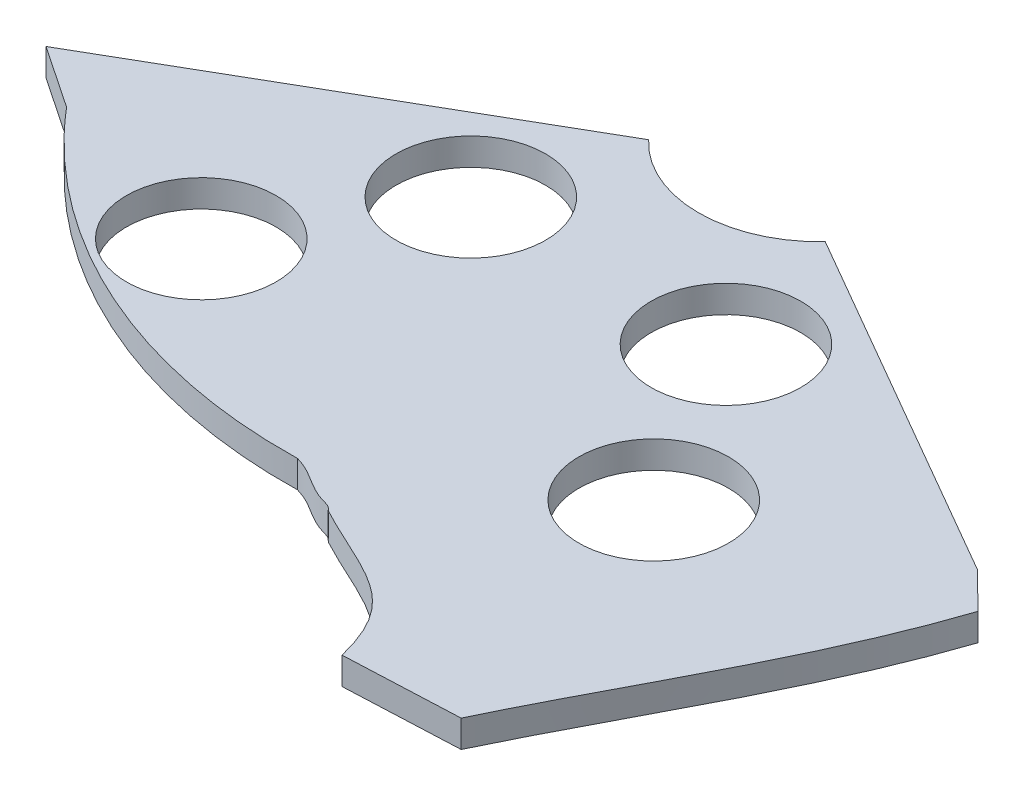
ISO-10303-21;
HEADER;
FILE_DESCRIPTION(('STEP AP214'),'2;1');
FILE_NAME('part.step','',(''),(''),'','','');
FILE_SCHEMA(('AUTOMOTIVE_DESIGN { 1 0 10303 214 1 1 1 1 }'));
ENDSEC;
DATA;
#1=APPLICATION_CONTEXT('core data for automotive mechanical design processes');
#2=APPLICATION_PROTOCOL_DEFINITION('international standard','automotive_design',2000,#1);
#3=PRODUCT_CONTEXT('',#1,'mechanical');
#4=PRODUCT('Part','Part','',(#3));
#5=PRODUCT_RELATED_PRODUCT_CATEGORY('part','',(#4));
#6=PRODUCT_DEFINITION_FORMATION('','',#4);
#7=PRODUCT_DEFINITION_CONTEXT('part definition',#1,'design');
#8=PRODUCT_DEFINITION('design','',#6,#7);
#9=PRODUCT_DEFINITION_SHAPE('','',#8);
#10=(LENGTH_UNIT() NAMED_UNIT(*) SI_UNIT(.MILLI.,.METRE.));
#11=(NAMED_UNIT(*) PLANE_ANGLE_UNIT() SI_UNIT($,.RADIAN.));
#12=(NAMED_UNIT(*) SI_UNIT($,.STERADIAN.) SOLID_ANGLE_UNIT());
#13=UNCERTAINTY_MEASURE_WITH_UNIT(LENGTH_MEASURE(1.E-05),#10,'distance_accuracy_value','');
#14=(GEOMETRIC_REPRESENTATION_CONTEXT(3) GLOBAL_UNCERTAINTY_ASSIGNED_CONTEXT((#13)) GLOBAL_UNIT_ASSIGNED_CONTEXT((#10,
#11,#12)) REPRESENTATION_CONTEXT('',''));
#15=CARTESIAN_POINT('',(0.,0.,0.));
#16=DIRECTION('',(0.,0.,1.));
#17=DIRECTION('',(1.,0.,0.));
#18=AXIS2_PLACEMENT_3D('',#15,#16,#17);
#19=CARTESIAN_POINT('',(0.,-55.7359999999999,0.));
#20=DIRECTION('',(0.,-1.,0.));
#21=DIRECTION('',(0.,0.,-1.));
#22=AXIS2_PLACEMENT_3D('',#19,#20,#21);
#23=PLANE('',#22);
#24=CARTESIAN_POINT('',(18.75,-55.7359999999999,32.476));
#25=DIRECTION('',(0.,-1.,0.));
#26=DIRECTION('',(0.,0.,-1.));
#27=AXIS2_PLACEMENT_3D('',#24,#25,#26);
#28=CIRCLE('',#27,10.999845998306);
#29=CARTESIAN_POINT('',(18.75,-55.7359999999999,21.476154001694));
#30=VERTEX_POINT('',#29);
#31=EDGE_CURVE('E330',#30,#30,#28,.T.);
#32=ORIENTED_EDGE('',*,*,#31,.F.);
#33=EDGE_LOOP('',(#32));
#34=FACE_BOUND('',#33,.T.);
#35=CARTESIAN_POINT('',(-33.25,-55.7359999999999,57.591));
#36=DIRECTION('',(0.,-1.,0.));
#37=DIRECTION('',(0.,0.,-1.));
#38=AXIS2_PLACEMENT_3D('',#35,#36,#37);
#39=CIRCLE('',#38,10.999845998306);
#40=CARTESIAN_POINT('',(-33.25,-55.7359999999999,46.591154001694));
#41=VERTEX_POINT('',#40);
#42=EDGE_CURVE('E323',#41,#41,#39,.T.);
#43=ORIENTED_EDGE('',*,*,#42,.F.);
#44=EDGE_LOOP('',(#43));
#45=FACE_BOUND('',#44,.T.);
#46=DIRECTION('',(-0.829811438442502,0.,-0.55804388414352));
#47=VECTOR('',#46,1.);
#48=CARTESIAN_POINT('',(-59.9026889800837,-55.7359999999999,50.7341335970389));
#49=LINE('',#48,#47);
#50=CARTESIAN_POINT('',(-59.9026889800837,-55.7359999999999,50.7341335970389));
#51=VERTEX_POINT('',#50);
#52=CARTESIAN_POINT('',(-69.1281865828208,-55.7359999999999,44.5300343560704));
#53=VERTEX_POINT('',#52);
#54=EDGE_CURVE('E319',#51,#53,#49,.T.);
#55=ORIENTED_EDGE('',*,*,#54,.T.);
#56=DIRECTION('',(0.866025113443951,0.,-0.500000502884138));
#57=VECTOR('',#56,1.);
#58=CARTESIAN_POINT('',(-69.1281865828208,-55.7359999999999,44.5300343560704));
#59=LINE('',#58,#57);
#60=CARTESIAN_POINT('',(-12.9766531358799,-55.7359999999999,12.1108879302399));
#61=VERTEX_POINT('',#60);
#62=EDGE_CURVE('E101',#53,#61,#59,.T.);
#63=ORIENTED_EDGE('',*,*,#62,.T.);
#64=CARTESIAN_POINT('',(0.,-55.7359999999999,0.));
#65=DIRECTION('',(0.,1.,0.));
#66=DIRECTION('',(0.,0.,-1.));
#67=AXIS2_PLACEMENT_3D('',#64,#65,#66);
#68=CIRCLE('',#67,17.7501305084715);
#69=CARTESIAN_POINT('',(12.9766531358511,-55.7359999999999,12.1108879302707));
#70=VERTEX_POINT('',#69);
#71=EDGE_CURVE('E316',#61,#70,#68,.T.);
#72=ORIENTED_EDGE('',*,*,#71,.T.);
#73=DIRECTION('',(0.866025113442762,0.,0.500000502886198));
#74=VECTOR('',#73,1.);
#75=CARTESIAN_POINT('',(12.9766531358511,-55.7359999999999,12.1108879302707));
#76=LINE('',#75,#74);
#77=CARTESIAN_POINT('',(65.8946490574716,-55.7359999999999,42.6631480920527));
#78=VERTEX_POINT('',#77);
#79=EDGE_CURVE('E311',#70,#78,#76,.T.);
#80=ORIENTED_EDGE('',*,*,#79,.T.);
#81=DIRECTION('',(0.71276060883614,0.,0.701407381263937));
#82=VECTOR('',#81,1.);
#83=CARTESIAN_POINT('',(65.8946490574716,-55.7359999999999,42.6631480920527));
#84=LINE('',#83,#82);
#85=CARTESIAN_POINT('',(71.2569655837216,-55.7359999999999,47.9400508074354));
#86=VERTEX_POINT('',#85);
#87=EDGE_CURVE('E292',#78,#86,#84,.T.);
#88=ORIENTED_EDGE('',*,*,#87,.T.);
#89=CARTESIAN_POINT('',(46.8641701729329,-55.7359999999999,99.5037287815529));
#90=CARTESIAN_POINT('',(47.0265115042572,-55.7359999999999,99.1639758438634));
#91=CARTESIAN_POINT('',(47.3534052611885,-55.7359999999999,98.4798425222766));
#92=CARTESIAN_POINT('',(48.1029507468316,-55.7359999999999,96.9321409517117));
#93=CARTESIAN_POINT('',(49.5477537564018,-55.7359999999999,94.0033280060252));
#94=CARTESIAN_POINT('',(51.732027717249,-55.7359999999999,89.7213104111649));
#95=CARTESIAN_POINT('',(54.4073463883031,-55.7359999999999,84.6111656064253));
#96=CARTESIAN_POINT('',(57.0950462566859,-55.7359999999999,79.5075655121861));
#97=CARTESIAN_POINT('',(59.7539425678854,-55.7359999999999,74.3895727380711));
#98=CARTESIAN_POINT('',(63.205579053323,-55.7359999999999,67.5258789821495));
#99=CARTESIAN_POINT('',(66.444433973775,-55.7359999999999,60.5582516015325));
#100=CARTESIAN_POINT('',(69.3268198353086,-55.7359999999999,53.4391651245445));
#101=CARTESIAN_POINT('',(70.6350197868272,-55.7359999999999,49.8037730442733));
#102=CARTESIAN_POINT('',(71.2501842992512,-55.7359999999999,47.9603715986118));
#103=CARTESIAN_POINT('',(71.2569655837216,-55.7359999999999,47.9400508074354));
#104=B_SPLINE_CURVE_WITH_KNOTS('',3,(#89,#90,#91,#92,#93,#94,#95,#96,#97,#98,#99,#100,#101,#102,
#103),.UNSPECIFIED.,.F.,.F.,(4,1,1,1,1,1,1,1,1,1,1,1,4),(0.,0.0197841570331341,
0.0398377749370308,0.090352224975045,0.191370070537669,0.292390723298131,0.393413635393049,
0.494432323574486,0.595411840898034,0.797075984450142,0.897894653524489,0.998874438647857,1.),.UNSPECIFIED.);
#105=CARTESIAN_POINT('',(46.8641701729329,-55.7359999999999,99.5037287815529));
#106=VERTEX_POINT('',#105);
#107=EDGE_CURVE('E244',#86,#106,#104,.F.);
#108=ORIENTED_EDGE('',*,*,#107,.T.);
#109=DIRECTION('',(-0.99902030206008,0.,0.0442542209488083));
#110=VECTOR('',#109,1.);
#111=CARTESIAN_POINT('',(46.8641701729329,-55.7359999999999,99.5037287815529));
#112=LINE('',#111,#110);
#113=CARTESIAN_POINT('',(30.0912883166282,-55.7359999999999,100.246727515499));
#114=VERTEX_POINT('',#113);
#115=EDGE_CURVE('E128',#106,#114,#112,.T.);
#116=ORIENTED_EDGE('',*,*,#115,.T.);
#117=CARTESIAN_POINT('',(10.7021695545972,-55.7359999999999,82.8693068197618));
#118=CARTESIAN_POINT('',(10.9675136919166,-55.7359999999999,83.0133841412206));
#119=CARTESIAN_POINT('',(11.6145615888685,-55.7359999999999,83.3574112982969));
#120=CARTESIAN_POINT('',(12.6933991443115,-55.7359999999999,83.9045634279865));
#121=CARTESIAN_POINT('',(13.7694716585437,-55.7359999999999,84.4264424495065));
#122=CARTESIAN_POINT('',(15.1536940168009,-55.7359999999999,85.0794640703698));
#123=CARTESIAN_POINT('',(16.8049849745752,-55.7359999999999,85.842126936412));
#124=CARTESIAN_POINT('',(18.8821519742874,-55.7359999999999,86.815188160623));
#125=CARTESIAN_POINT('',(20.9239285814879,-55.7359999999999,87.8518072734378));
#126=CARTESIAN_POINT('',(22.8957800805199,-55.7359999999999,89.0177780126231));
#127=CARTESIAN_POINT('',(24.7379643670664,-55.7359999999999,90.388313116472));
#128=CARTESIAN_POINT('',(26.0889968196911,-55.7359999999999,91.7442165107431));
#129=CARTESIAN_POINT('',(27.0241346187956,-55.7359999999999,92.9479614874679));
#130=CARTESIAN_POINT('',(27.6482925382816,-55.7359999999999,93.8961812701836));
#131=CARTESIAN_POINT('',(28.2076529250503,-55.7359999999999,94.9000883087401));
#132=CARTESIAN_POINT('',(28.6098476237093,-55.7359999999999,95.7509898906972));
#133=CARTESIAN_POINT('',(28.8976421765824,-55.7359999999999,96.4353672784788));
#134=CARTESIAN_POINT('',(29.092105617481,-55.7359999999999,96.932761864078));
#135=CARTESIAN_POINT('',(29.2785297597457,-55.7359999999999,97.4458234702081));
#136=CARTESIAN_POINT('',(29.4570267990977,-55.7359999999999,97.9747138386339));
#137=CARTESIAN_POINT('',(29.6277727458872,-55.7359999999999,98.519551210424));
#138=CARTESIAN_POINT('',(29.7906463028335,-55.7359999999999,99.0805104353948));
#139=CARTESIAN_POINT('',(29.9466361992917,-55.7359999999999,99.657463530404));
#140=CARTESIAN_POINT('',(30.0427046456018,-55.7359999999999,100.048814010141));
#141=CARTESIAN_POINT('',(30.0912883166282,-55.7359999999999,100.246727515499));
#142=B_SPLINE_CURVE_WITH_KNOTS('',3,(#117,#118,#119,#120,#121,#122,#123,#124,#125,#126,#127,
#128,#129,#130,#131,#132,#133,#134,#135,#136,#137,#138,#139,#140,#141),.UNSPECIFIED.,.F.,.F.,(4,
1,1,1,1,1,1,1,1,1,1,1,1,1,1,1,1,1,1,1,1,1,4),(0.,0.0311053789907297,0.0754938822372659,
0.124612365066205,0.15430953554767,0.233171101897679,0.31200037754726,0.390613081095202,
0.46899979538581,0.547734881795915,0.626539846701343,0.665271985243445,0.704629857498265,
0.743369873375361,0.783575693819359,0.801518810116923,0.819850640318988,0.838589345978821,
0.857751633808876,0.877352807158534,0.897406821958587,0.917926226477165,0.93892049238304),.UNSPECIFIED.);
#143=CARTESIAN_POINT('',(10.702169554607,-55.7359999999999,82.8693068197671));
#144=VERTEX_POINT('',#143);
#145=EDGE_CURVE('E120',#114,#144,#142,.F.);
#146=ORIENTED_EDGE('',*,*,#145,.T.);
#147=CARTESIAN_POINT('',(1.78759080649489,-55.7359999999999,78.4791809716169));
#148=CARTESIAN_POINT('',(1.86611483391024,-55.7359999999999,78.50208582267));
#149=CARTESIAN_POINT('',(2.01454982366164,-55.7359999999999,78.545383160354));
#150=CARTESIAN_POINT('',(2.32717764748113,-55.7359999999999,78.6447134972182));
#151=CARTESIAN_POINT('',(2.88503031573728,-55.7359999999999,78.8416157048517));
#152=CARTESIAN_POINT('',(3.67875011300494,-55.7359999999999,79.1865082825985));
#153=CARTESIAN_POINT('',(4.5916431569298,-55.7359999999999,79.6815420613968));
#154=CARTESIAN_POINT('',(5.32869270280636,-55.7359999999999,80.1364074170496));
#155=CARTESIAN_POINT('',(5.91786643705039,-55.7359999999999,80.5030573597553));
#156=CARTESIAN_POINT('',(6.51021516800735,-55.7359999999999,80.8622799860879));
#157=CARTESIAN_POINT('',(7.26626333955956,-55.7359999999999,81.2827982001088));
#158=CARTESIAN_POINT('',(8.05817996956523,-55.7359999999999,81.6336987758542));
#159=CARTESIAN_POINT('',(8.61707654654181,-55.7359999999999,81.8294901349075));
#160=CARTESIAN_POINT('',(9.48118675970946,-55.7359999999999,82.0963864525241));
#161=CARTESIAN_POINT('',(10.2068056960977,-55.7359999999999,82.218104211485));
#162=CARTESIAN_POINT('',(10.7021695546157,-55.7359999999999,82.8693068197606));
#163=B_SPLINE_CURVE_WITH_KNOTS('',3,(#147,#148,#149,#150,#151,#152,#153,#154,#155,#156,#157,
#158,#159,#160,#161,#162),.UNSPECIFIED.,.F.,.F.,(4,1,1,1,1,1,1,1,1,1,1,1,1,4),
(-0.432204638892321,-0.402257498925563,-0.375595170932457,-0.312112875645156,-0.185727956735441,
-0.0592405553676042,0.0677662645816927,0.131338895871027,0.194834804074498,0.321408196780351,
0.447827551805123,0.511369746514113,0.538135298637163,0.778915690365187),.UNSPECIFIED.);
#164=CARTESIAN_POINT('',(1.78759080649489,-55.7359999999999,78.4791809716169));
#165=VERTEX_POINT('',#164);
#166=EDGE_CURVE('E125',#144,#165,#163,.F.);
#167=ORIENTED_EDGE('',*,*,#166,.T.);
#168=CARTESIAN_POINT('',(-59.9026889800837,-55.7359999999999,50.7341335970389));
#169=CARTESIAN_POINT('',(-56.1364810023361,-55.7359999999999,55.1801667903006));
#170=CARTESIAN_POINT('',(-51.8729053251242,-55.7359999999999,59.2071280243108));
#171=CARTESIAN_POINT('',(-44.8893655819632,-55.7359999999999,64.4645799991853));
#172=CARTESIAN_POINT('',(-42.4634872738905,-55.7359999999999,66.0877313134504));
#173=CARTESIAN_POINT('',(-37.4473849856873,-55.7359999999999,69.0542236916702));
#174=CARTESIAN_POINT('',(-34.8574828460895,-55.7359999999999,70.3967494896049));
#175=CARTESIAN_POINT('',(-29.5414719880855,-55.7359999999999,72.7872093066937));
#176=CARTESIAN_POINT('',(-26.8178007031177,-55.7359999999999,73.8350289916238));
#177=CARTESIAN_POINT('',(-21.2710748649198,-55.7359999999999,75.6194401283735));
#178=CARTESIAN_POINT('',(-18.4471151931364,-55.7359999999999,76.3570128349456));
#179=CARTESIAN_POINT('',(-9.87915904933974,-55.7359999999999,78.0932034608287));
#180=CARTESIAN_POINT('',(-4.03874659644219,-55.7359999999999,78.6113119438143));
#181=CARTESIAN_POINT('',(1.78759080659621,-55.7359999999999,78.4791809760741));
#182=B_SPLINE_CURVE_WITH_KNOTS('',3,(#168,#169,#170,#171,#172,#173,#174,#175,#176,#177,#178,
#179,#180,#181),.UNSPECIFIED.,.F.,.F.,(4,2,2,2,2,2,4),(1.58787845205843E-06,0.250001587878453,
0.375001587878453,0.500001587878453,0.625001587878453,0.750001587878452,1.),.UNSPECIFIED.);
#183=EDGE_CURVE('E49',#165,#51,#182,.F.);
#184=ORIENTED_EDGE('',*,*,#183,.T.);
#185=EDGE_LOOP('',(#55,#63,#72,#80,#88,#108,#116,#146,#167,#184));
#186=FACE_BOUND('',#185,.T.);
#187=CARTESIAN_POINT('',(33.25,-55.7359999999999,57.591));
#188=DIRECTION('',(0.,-1.,0.));
#189=DIRECTION('',(0.,0.,-1.));
#190=AXIS2_PLACEMENT_3D('',#187,#188,#189);
#191=CIRCLE('',#190,10.999845998306);
#192=CARTESIAN_POINT('',(33.25,-55.7359999999999,46.591154001694));
#193=VERTEX_POINT('',#192);
#194=EDGE_CURVE('E324',#193,#193,#191,.T.);
#195=ORIENTED_EDGE('',*,*,#194,.F.);
#196=EDGE_LOOP('',(#195));
#197=FACE_BOUND('',#196,.T.);
#198=CARTESIAN_POINT('',(-18.75,-55.7359999999999,32.476));
#199=DIRECTION('',(0.,-1.,0.));
#200=DIRECTION('',(0.,0.,-1.));
#201=AXIS2_PLACEMENT_3D('',#198,#199,#200);
#202=CIRCLE('',#201,10.999845998306);
#203=CARTESIAN_POINT('',(-18.75,-55.7359999999999,21.476154001694));
#204=VERTEX_POINT('',#203);
#205=EDGE_CURVE('E336',#204,#204,#202,.T.);
#206=ORIENTED_EDGE('',*,*,#205,.F.);
#207=EDGE_LOOP('',(#206));
#208=FACE_BOUND('',#207,.T.);
#209=ADVANCED_FACE('F30',(#34,#45,#186,#197,#208),#23,.T.);
#210=CARTESIAN_POINT('',(0.,-51.7359999999999,0.));
#211=DIRECTION('',(0.,-1.,0.));
#212=DIRECTION('',(0.,0.,-1.));
#213=AXIS2_PLACEMENT_3D('',#210,#211,#212);
#214=PLANE('',#213);
#215=CARTESIAN_POINT('',(18.75,-51.7359999999999,32.476));
#216=DIRECTION('',(0.,-1.,0.));
#217=DIRECTION('',(0.,0.,-1.));
#218=AXIS2_PLACEMENT_3D('',#215,#216,#217);
#219=CIRCLE('',#218,10.999845998306);
#220=CARTESIAN_POINT('',(18.75,-51.7359999999999,21.476154001694));
#221=VERTEX_POINT('',#220);
#222=EDGE_CURVE('E333',#221,#221,#219,.T.);
#223=ORIENTED_EDGE('',*,*,#222,.T.);
#224=EDGE_LOOP('',(#223));
#225=FACE_BOUND('',#224,.T.);
#226=CARTESIAN_POINT('',(-33.25,-51.7359999999999,57.591));
#227=DIRECTION('',(0.,-1.,0.));
#228=DIRECTION('',(0.,0.,-1.));
#229=AXIS2_PLACEMENT_3D('',#226,#227,#228);
#230=CIRCLE('',#229,10.999845998306);
#231=CARTESIAN_POINT('',(-33.25,-51.7359999999999,46.591154001694));
#232=VERTEX_POINT('',#231);
#233=EDGE_CURVE('E320',#232,#232,#230,.T.);
#234=ORIENTED_EDGE('',*,*,#233,.T.);
#235=EDGE_LOOP('',(#234));
#236=FACE_BOUND('',#235,.T.);
#237=DIRECTION('',(-0.829811438442502,0.,-0.55804388414352));
#238=VECTOR('',#237,1.);
#239=CARTESIAN_POINT('',(-59.9026889800837,-51.7359999999999,50.7341335970389));
#240=LINE('',#239,#238);
#241=CARTESIAN_POINT('',(-59.9026889800837,-51.7359999999999,50.7341335970389));
#242=VERTEX_POINT('',#241);
#243=CARTESIAN_POINT('',(-69.1281865828208,-51.7359999999999,44.5300343560704));
#244=VERTEX_POINT('',#243);
#245=EDGE_CURVE('E192',#242,#244,#240,.T.);
#246=ORIENTED_EDGE('',*,*,#245,.F.);
#247=CARTESIAN_POINT('',(1.78770182548704,-51.7359999999999,78.4791784582845));
#248=CARTESIAN_POINT('',(-4.0386724050451,-51.7359999999999,78.6113185253767));
#249=CARTESIAN_POINT('',(-9.87912276952495,-51.7359999999999,78.0932108124856));
#250=CARTESIAN_POINT('',(-18.4471151931364,-51.7359999999999,76.3570128349456));
#251=CARTESIAN_POINT('',(-21.2710748649198,-51.7359999999999,75.6194401283735));
#252=CARTESIAN_POINT('',(-26.8178007031177,-51.7359999999999,73.8350289916238));
#253=CARTESIAN_POINT('',(-29.5414719880855,-51.7359999999999,72.7872093066937));
#254=CARTESIAN_POINT('',(-34.8574828460895,-51.7359999999999,70.3967494896049));
#255=CARTESIAN_POINT('',(-37.4473849856873,-51.7359999999999,69.0542236916702));
#256=CARTESIAN_POINT('',(-42.4634872738905,-51.7359999999999,66.0877313134504));
#257=CARTESIAN_POINT('',(-44.8893655819632,-51.7359999999999,64.4645799991853));
#258=CARTESIAN_POINT('',(-51.8729053251242,-51.7359999999999,59.2071280243108));
#259=CARTESIAN_POINT('',(-56.1364810023361,-51.7359999999999,55.1801667903006));
#260=CARTESIAN_POINT('',(-59.9026889800837,-51.7359999999999,50.7341335970389));
#261=B_SPLINE_CURVE_WITH_KNOTS('',3,(#247,#248,#249,#250,#251,#252,#253,#254,#255,#256,#257,
#258,#259,#260),.UNSPECIFIED.,.F.,.F.,(4,2,2,2,2,2,4),(0.,0.25,0.375,0.5,0.625,0.75,1.),.UNSPECIFIED.);
#262=CARTESIAN_POINT('',(1.78759080649489,-51.7359999999999,78.4791809716169));
#263=VERTEX_POINT('',#262);
#264=EDGE_CURVE('E92',#263,#242,#261,.T.);
#265=ORIENTED_EDGE('',*,*,#264,.F.);
#266=CARTESIAN_POINT('',(10.7021695546157,-51.7359999999999,82.8693068197606));
#267=CARTESIAN_POINT('',(10.2068056960977,-51.7359999999999,82.218104211485));
#268=CARTESIAN_POINT('',(9.48118675970946,-51.7359999999999,82.0963864525241));
#269=CARTESIAN_POINT('',(8.61707654654181,-51.7359999999999,81.8294901349075));
#270=CARTESIAN_POINT('',(8.05817996956523,-51.7359999999999,81.6336987758542));
#271=CARTESIAN_POINT('',(7.26626333955956,-51.7359999999999,81.2827982001088));
#272=CARTESIAN_POINT('',(6.51021516800735,-51.7359999999999,80.8622799860879));
#273=CARTESIAN_POINT('',(5.91786643705039,-51.7359999999999,80.5030573597553));
#274=CARTESIAN_POINT('',(5.32869270280636,-51.7359999999999,80.1364074170496));
#275=CARTESIAN_POINT('',(4.5916431569298,-51.7359999999999,79.6815420613968));
#276=CARTESIAN_POINT('',(3.67875011300494,-51.7359999999999,79.1865082825985));
#277=CARTESIAN_POINT('',(2.88503031573728,-51.7359999999999,78.8416157048517));
#278=CARTESIAN_POINT('',(2.32717764748113,-51.7359999999999,78.6447134972182));
#279=CARTESIAN_POINT('',(2.01454982366164,-51.7359999999999,78.545383160354));
#280=CARTESIAN_POINT('',(1.86611483391024,-51.7359999999999,78.50208582267));
#281=CARTESIAN_POINT('',(1.78759080649489,-51.7359999999999,78.4791809716169));
#282=B_SPLINE_CURVE_WITH_KNOTS('',3,(#266,#267,#268,#269,#270,#271,#272,#273,#274,#275,#276,
#277,#278,#279,#280,#281),.UNSPECIFIED.,.F.,.F.,(4,1,1,1,1,1,1,1,1,1,1,1,1,4),
(-0.432204638892321,-0.191424247164296,-0.164658695041246,-0.101116500332256,0.0253028546925155,
0.151876247398369,0.215372155601839,0.278944786891174,0.405951606840471,0.532439008208308,
0.658823927118023,0.722306222405324,0.748968550398429,0.778915690365187),.UNSPECIFIED.);
#283=CARTESIAN_POINT('',(10.702169554607,-51.7359999999999,82.8693068197671));
#284=VERTEX_POINT('',#283);
#285=EDGE_CURVE('E85',#284,#263,#282,.T.);
#286=ORIENTED_EDGE('',*,*,#285,.F.);
#287=CARTESIAN_POINT('',(30.0912883166282,-51.7359999999999,100.246727515499));
#288=CARTESIAN_POINT('',(30.0427046456018,-51.7359999999999,100.048814010141));
#289=CARTESIAN_POINT('',(29.9466361992917,-51.7359999999999,99.657463530404));
#290=CARTESIAN_POINT('',(29.7906463028335,-51.7359999999999,99.0805104353948));
#291=CARTESIAN_POINT('',(29.6277727458872,-51.7359999999999,98.519551210424));
#292=CARTESIAN_POINT('',(29.4570267990977,-51.7359999999999,97.9747138386339));
#293=CARTESIAN_POINT('',(29.2785297597457,-51.7359999999999,97.4458234702081));
#294=CARTESIAN_POINT('',(29.092105617481,-51.7359999999999,96.932761864078));
#295=CARTESIAN_POINT('',(28.8976421765824,-51.7359999999999,96.4353672784788));
#296=CARTESIAN_POINT('',(28.6098476237093,-51.7359999999999,95.7509898906972));
#297=CARTESIAN_POINT('',(28.2076529250503,-51.7359999999999,94.9000883087401));
#298=CARTESIAN_POINT('',(27.6482925382816,-51.7359999999999,93.8961812701836));
#299=CARTESIAN_POINT('',(27.0241346187956,-51.7359999999999,92.9479614874679));
#300=CARTESIAN_POINT('',(26.0889968196911,-51.7359999999999,91.7442165107431));
#301=CARTESIAN_POINT('',(24.7379643670664,-51.7359999999999,90.388313116472));
#302=CARTESIAN_POINT('',(22.8957800805199,-51.7359999999999,89.0177780126231));
#303=CARTESIAN_POINT('',(20.9239285814879,-51.7359999999999,87.8518072734378));
#304=CARTESIAN_POINT('',(18.8821519742874,-51.7359999999999,86.815188160623));
#305=CARTESIAN_POINT('',(16.8049849745752,-51.7359999999999,85.842126936412));
#306=CARTESIAN_POINT('',(15.1536940168009,-51.7359999999999,85.0794640703698));
#307=CARTESIAN_POINT('',(13.7694716585437,-51.7359999999999,84.4264424495065));
#308=CARTESIAN_POINT('',(12.6933991443115,-51.7359999999999,83.9045634279865));
#309=CARTESIAN_POINT('',(11.6145615888685,-51.7359999999999,83.3574112982969));
#310=CARTESIAN_POINT('',(10.9675136919166,-51.7359999999999,83.0133841412206));
#311=CARTESIAN_POINT('',(10.7021695545972,-51.7359999999999,82.8693068197618));
#312=B_SPLINE_CURVE_WITH_KNOTS('',3,(#287,#288,#289,#290,#291,#292,#293,#294,#295,#296,#297,
#298,#299,#300,#301,#302,#303,#304,#305,#306,#307,#308,#309,#310,#311),.UNSPECIFIED.,.F.,.F.,(4,
1,1,1,1,1,1,1,1,1,1,1,1,1,1,1,1,1,1,1,1,1,4),(0.,0.0209942659058756,0.0415136704244533,
0.0615676852245057,0.0811688585741645,0.100331146404219,0.119069852064053,0.137401682266118,
0.155344798563681,0.19555061900768,0.234290634884776,0.273648507139595,0.312380645681697,
0.391185610587126,0.46992069699723,0.548307411287838,0.626920114835781,0.705749390485361,
0.78461095683537,0.814308127316835,0.863426610145774,0.90781511339231,0.93892049238304),.UNSPECIFIED.);
#313=CARTESIAN_POINT('',(30.0912883166282,-51.7359999999999,100.246727515499));
#314=VERTEX_POINT('',#313);
#315=EDGE_CURVE('E138',#314,#284,#312,.T.);
#316=ORIENTED_EDGE('',*,*,#315,.F.);
#317=DIRECTION('',(-0.99902030206008,0.,0.0442542209488083));
#318=VECTOR('',#317,1.);
#319=CARTESIAN_POINT('',(46.8641701729329,-51.7359999999999,99.5037287815529));
#320=LINE('',#319,#318);
#321=CARTESIAN_POINT('',(46.8641701729329,-51.7359999999999,99.5037287815529));
#322=VERTEX_POINT('',#321);
#323=EDGE_CURVE('E265',#322,#314,#320,.T.);
#324=ORIENTED_EDGE('',*,*,#323,.F.);
#325=CARTESIAN_POINT('',(71.2569655837216,-51.7359999999999,47.9400508074354));
#326=CARTESIAN_POINT('',(71.2501842992512,-51.7359999999999,47.9603715986118));
#327=CARTESIAN_POINT('',(70.6350197868272,-51.7359999999999,49.8037730442733));
#328=CARTESIAN_POINT('',(69.3268198353086,-51.7359999999999,53.4391651245445));
#329=CARTESIAN_POINT('',(66.444433973775,-51.7359999999999,60.5582516015325));
#330=CARTESIAN_POINT('',(63.205579053323,-51.7359999999999,67.5258789821495));
#331=CARTESIAN_POINT('',(59.7539425678854,-51.7359999999999,74.3895727380711));
#332=CARTESIAN_POINT('',(57.0950462566859,-51.7359999999999,79.5075655121861));
#333=CARTESIAN_POINT('',(54.4073463883031,-51.7359999999999,84.6111656064253));
#334=CARTESIAN_POINT('',(51.732027717249,-51.7359999999999,89.7213104111649));
#335=CARTESIAN_POINT('',(49.5477537564018,-51.7359999999999,94.0033280060252));
#336=CARTESIAN_POINT('',(48.1029507468316,-51.7359999999999,96.9321409517117));
#337=CARTESIAN_POINT('',(47.3534052611885,-51.7359999999999,98.4798425222766));
#338=CARTESIAN_POINT('',(47.0265115042572,-51.7359999999999,99.1639758438634));
#339=CARTESIAN_POINT('',(46.8641701729329,-51.7359999999999,99.5037287815529));
#340=B_SPLINE_CURVE_WITH_KNOTS('',3,(#325,#326,#327,#328,#329,#330,#331,#332,#333,#334,#335,
#336,#337,#338,#339),.UNSPECIFIED.,.F.,.F.,(4,1,1,1,1,1,1,1,1,1,1,1,4),(0.,0.00112556135214314,
0.102105346475511,0.202924015549858,0.404588159101966,0.505567676425514,0.606586364606951,
0.707609276701869,0.808629929462331,0.909647775024955,0.960162225062969,0.980215842966866,1.),.UNSPECIFIED.);
#341=CARTESIAN_POINT('',(71.2569655837216,-51.7359999999999,47.9400508074354));
#342=VERTEX_POINT('',#341);
#343=EDGE_CURVE('E272',#342,#322,#340,.T.);
#344=ORIENTED_EDGE('',*,*,#343,.F.);
#345=DIRECTION('',(0.71276060883614,0.,0.701407381263937));
#346=VECTOR('',#345,1.);
#347=CARTESIAN_POINT('',(65.8946490574716,-51.7359999999999,42.6631480920527));
#348=LINE('',#347,#346);
#349=CARTESIAN_POINT('',(65.8946490574716,-51.7359999999999,42.6631480920527));
#350=VERTEX_POINT('',#349);
#351=EDGE_CURVE('E196',#350,#342,#348,.T.);
#352=ORIENTED_EDGE('',*,*,#351,.F.);
#353=DIRECTION('',(0.866025113442762,0.,0.500000502886198));
#354=VECTOR('',#353,1.);
#355=CARTESIAN_POINT('',(12.9766531358511,-51.7359999999999,12.1108879302707));
#356=LINE('',#355,#354);
#357=CARTESIAN_POINT('',(12.9766531358511,-51.7359999999999,12.1108879302707));
#358=VERTEX_POINT('',#357);
#359=EDGE_CURVE('E194',#358,#350,#356,.T.);
#360=ORIENTED_EDGE('',*,*,#359,.F.);
#361=CARTESIAN_POINT('',(0.,-51.7359999999999,0.));
#362=DIRECTION('',(0.,1.,0.));
#363=DIRECTION('',(0.,0.,-1.));
#364=AXIS2_PLACEMENT_3D('',#361,#362,#363);
#365=CIRCLE('',#364,17.7501305084715);
#366=CARTESIAN_POINT('',(-12.9766531358799,-51.7359999999999,12.1108879302399));
#367=VERTEX_POINT('',#366);
#368=EDGE_CURVE('E191',#367,#358,#365,.T.);
#369=ORIENTED_EDGE('',*,*,#368,.F.);
#370=DIRECTION('',(0.866025113443951,0.,-0.500000502884138));
#371=VECTOR('',#370,1.);
#372=CARTESIAN_POINT('',(-69.1281865828208,-51.7359999999999,44.5300343560704));
#373=LINE('',#372,#371);
#374=EDGE_CURVE('E186',#244,#367,#373,.T.);
#375=ORIENTED_EDGE('',*,*,#374,.F.);
#376=EDGE_LOOP('',(#246,#265,#286,#316,#324,#344,#352,#360,#369,#375));
#377=FACE_BOUND('',#376,.T.);
#378=CARTESIAN_POINT('',(33.25,-51.7359999999999,57.591));
#379=DIRECTION('',(0.,-1.,0.));
#380=DIRECTION('',(0.,0.,-1.));
#381=AXIS2_PLACEMENT_3D('',#378,#379,#380);
#382=CIRCLE('',#381,10.999845998306);
#383=CARTESIAN_POINT('',(33.25,-51.7359999999999,46.591154001694));
#384=VERTEX_POINT('',#383);
#385=EDGE_CURVE('E327',#384,#384,#382,.T.);
#386=ORIENTED_EDGE('',*,*,#385,.T.);
#387=EDGE_LOOP('',(#386));
#388=FACE_BOUND('',#387,.T.);
#389=CARTESIAN_POINT('',(-18.75,-51.7359999999999,32.476));
#390=DIRECTION('',(0.,-1.,0.));
#391=DIRECTION('',(0.,0.,-1.));
#392=AXIS2_PLACEMENT_3D('',#389,#390,#391);
#393=CIRCLE('',#392,10.999845998306);
#394=CARTESIAN_POINT('',(-18.75,-51.7359999999999,21.476154001694));
#395=VERTEX_POINT('',#394);
#396=EDGE_CURVE('E339',#395,#395,#393,.T.);
#397=ORIENTED_EDGE('',*,*,#396,.T.);
#398=EDGE_LOOP('',(#397));
#399=FACE_BOUND('',#398,.T.);
#400=ADVANCED_FACE('F218',(#225,#236,#377,#388,#399),#214,.F.);
#401=CARTESIAN_POINT('',(-59.9026889800837,-55.7359999999999,50.7341335970389));
#402=DIRECTION('',(0.55804388414352,0.,-0.829811438442502));
#403=DIRECTION('',(-0.829811438442502,0.,-0.55804388414352));
#404=AXIS2_PLACEMENT_3D('',#401,#402,#403);
#405=PLANE('',#404);
#406=ORIENTED_EDGE('',*,*,#245,.T.);
#407=DIRECTION('',(0.,1.,0.));
#408=VECTOR('',#407,1.);
#409=CARTESIAN_POINT('',(-69.1281865828208,-55.7359999999999,44.5300343560704));
#410=LINE('',#409,#408);
#411=EDGE_CURVE('E11',#53,#244,#410,.T.);
#412=ORIENTED_EDGE('',*,*,#411,.F.);
#413=ORIENTED_EDGE('',*,*,#54,.F.);
#414=DIRECTION('',(0.,1.,0.));
#415=VECTOR('',#414,1.);
#416=CARTESIAN_POINT('',(-59.9026889800837,-55.7359999999999,50.7341335970389));
#417=LINE('',#416,#415);
#418=EDGE_CURVE('E501',#51,#242,#417,.T.);
#419=ORIENTED_EDGE('',*,*,#418,.T.);
#420=EDGE_LOOP('',(#406,#412,#413,#419));
#421=FACE_BOUND('',#420,.T.);
#422=ADVANCED_FACE('F32',(#421),#405,.F.);
#423=CARTESIAN_POINT('',(-69.1281865828208,-55.7359999999999,44.5300343560704));
#424=DIRECTION('',(0.500000502884138,0.,0.866025113443951));
#425=DIRECTION('',(0.866025113443951,0.,-0.500000502884138));
#426=AXIS2_PLACEMENT_3D('',#423,#424,#425);
#427=PLANE('',#426);
#428=ORIENTED_EDGE('',*,*,#374,.T.);
#429=DIRECTION('',(0.,1.,0.));
#430=VECTOR('',#429,1.);
#431=CARTESIAN_POINT('',(-12.9766531358799,-55.7359999999999,12.1108879302399));
#432=LINE('',#431,#430);
#433=EDGE_CURVE('E40',#61,#367,#432,.T.);
#434=ORIENTED_EDGE('',*,*,#433,.F.);
#435=ORIENTED_EDGE('',*,*,#62,.F.);
#436=ORIENTED_EDGE('',*,*,#411,.T.);
#437=EDGE_LOOP('',(#428,#434,#435,#436));
#438=FACE_BOUND('',#437,.T.);
#439=ADVANCED_FACE('F358',(#438),#427,.F.);
#440=CARTESIAN_POINT('',(0.,-55.7359999999999,0.));
#441=DIRECTION('',(0.,1.,0.));
#442=DIRECTION('',(0.,0.,1.));
#443=AXIS2_PLACEMENT_3D('',#440,#441,#442);
#444=CYLINDRICAL_SURFACE('',#443,17.7501305084715);
#445=ORIENTED_EDGE('',*,*,#368,.T.);
#446=DIRECTION('',(0.,1.,0.));
#447=VECTOR('',#446,1.);
#448=CARTESIAN_POINT('',(12.9766531358511,-55.7359999999999,12.1108879302707));
#449=LINE('',#448,#447);
#450=EDGE_CURVE('E200',#70,#358,#449,.T.);
#451=ORIENTED_EDGE('',*,*,#450,.F.);
#452=ORIENTED_EDGE('',*,*,#71,.F.);
#453=ORIENTED_EDGE('',*,*,#433,.T.);
#454=EDGE_LOOP('',(#445,#451,#452,#453));
#455=FACE_BOUND('',#454,.T.);
#456=ADVANCED_FACE('F425',(#455),#444,.F.);
#457=CARTESIAN_POINT('',(12.9766531358511,-55.7359999999999,12.1108879302707));
#458=DIRECTION('',(-0.500000502886198,0.,0.866025113442762));
#459=DIRECTION('',(0.866025113442762,0.,0.500000502886198));
#460=AXIS2_PLACEMENT_3D('',#457,#458,#459);
#461=PLANE('',#460);
#462=ORIENTED_EDGE('',*,*,#359,.T.);
#463=DIRECTION('',(0.,1.,0.));
#464=VECTOR('',#463,1.);
#465=CARTESIAN_POINT('',(65.8946490574716,-55.7359999999999,42.6631480920527));
#466=LINE('',#465,#464);
#467=EDGE_CURVE('E197',#78,#350,#466,.T.);
#468=ORIENTED_EDGE('',*,*,#467,.F.);
#469=ORIENTED_EDGE('',*,*,#79,.F.);
#470=ORIENTED_EDGE('',*,*,#450,.T.);
#471=EDGE_LOOP('',(#462,#468,#469,#470));
#472=FACE_BOUND('',#471,.T.);
#473=ADVANCED_FACE('F417',(#472),#461,.F.);
#474=CARTESIAN_POINT('',(65.8946490574716,-55.7359999999999,42.6631480920527));
#475=DIRECTION('',(-0.701407381263937,0.,0.71276060883614));
#476=DIRECTION('',(0.71276060883614,0.,0.701407381263937));
#477=AXIS2_PLACEMENT_3D('',#474,#475,#476);
#478=PLANE('',#477);
#479=ORIENTED_EDGE('',*,*,#351,.T.);
#480=DIRECTION('',(0.,1.,0.));
#481=VECTOR('',#480,1.);
#482=CARTESIAN_POINT('',(71.2569655837216,-55.7359999999999,47.9400508074354));
#483=LINE('',#482,#481);
#484=EDGE_CURVE('E201',#86,#342,#483,.T.);
#485=ORIENTED_EDGE('',*,*,#484,.F.);
#486=ORIENTED_EDGE('',*,*,#87,.F.);
#487=ORIENTED_EDGE('',*,*,#467,.T.);
#488=EDGE_LOOP('',(#479,#485,#486,#487));
#489=FACE_BOUND('',#488,.T.);
#490=ADVANCED_FACE('F304',(#489),#478,.F.);
#491=CARTESIAN_POINT('',(71.2569655837216,-55.7359999999999,47.9400508074354));
#492=CARTESIAN_POINT('',(71.2501842992512,-55.7359999999999,47.9603715986118));
#493=CARTESIAN_POINT('',(70.6350197868272,-55.7359999999999,49.8037730442733));
#494=CARTESIAN_POINT('',(69.3268198353086,-55.7359999999999,53.4391651245445));
#495=CARTESIAN_POINT('',(66.444433973775,-55.7359999999999,60.5582516015325));
#496=CARTESIAN_POINT('',(63.205579053323,-55.7359999999999,67.5258789821495));
#497=CARTESIAN_POINT('',(59.7539425678854,-55.7359999999999,74.3895727380711));
#498=CARTESIAN_POINT('',(57.0950462566859,-55.7359999999999,79.5075655121861));
#499=CARTESIAN_POINT('',(54.4073463883031,-55.7359999999999,84.6111656064253));
#500=CARTESIAN_POINT('',(51.732027717249,-55.7359999999999,89.7213104111649));
#501=CARTESIAN_POINT('',(49.5477537564018,-55.7359999999999,94.0033280060252));
#502=CARTESIAN_POINT('',(48.1029507468316,-55.7359999999999,96.9321409517117));
#503=CARTESIAN_POINT('',(47.3534052611885,-55.7359999999999,98.4798425222766));
#504=CARTESIAN_POINT('',(47.0265115042572,-55.7359999999999,99.1639758438634));
#505=CARTESIAN_POINT('',(46.8641701729329,-55.7359999999999,99.5037287815529));
#506=B_SPLINE_CURVE_WITH_KNOTS('',3,(#491,#492,#493,#494,#495,#496,#497,#498,#499,#500,#501,
#502,#503,#504,#505),.UNSPECIFIED.,.F.,.F.,(4,1,1,1,1,1,1,1,1,1,1,1,4),(0.,0.00112556135214314,
0.102105346475511,0.202924015549858,0.404588159101966,0.505567676425514,0.606586364606951,
0.707609276701869,0.808629929462331,0.909647775024955,0.960162225062969,0.980215842966866,1.),.UNSPECIFIED.);
#507=DIRECTION('',(0.,1.,0.));
#508=VECTOR('',#507,1.);
#509=SURFACE_OF_LINEAR_EXTRUSION('',#506,#508);
#510=ORIENTED_EDGE('',*,*,#343,.T.);
#511=DIRECTION('',(0.,1.,0.));
#512=VECTOR('',#511,1.);
#513=CARTESIAN_POINT('',(46.8641701729329,-55.7359999999999,99.5037287815529));
#514=LINE('',#513,#512);
#515=EDGE_CURVE('E248',#106,#322,#514,.T.);
#516=ORIENTED_EDGE('',*,*,#515,.F.);
#517=ORIENTED_EDGE('',*,*,#107,.F.);
#518=ORIENTED_EDGE('',*,*,#484,.T.);
#519=EDGE_LOOP('',(#510,#516,#517,#518));
#520=FACE_BOUND('',#519,.T.);
#521=ADVANCED_FACE('F294',(#520),#509,.F.);
#522=CARTESIAN_POINT('',(46.8641701729329,-55.7359999999999,99.5037287815529));
#523=DIRECTION('',(-0.0442542209488083,0.,-0.99902030206008));
#524=DIRECTION('',(-0.99902030206008,0.,0.0442542209488083));
#525=AXIS2_PLACEMENT_3D('',#522,#523,#524);
#526=PLANE('',#525);
#527=ORIENTED_EDGE('',*,*,#323,.T.);
#528=DIRECTION('',(0.,1.,0.));
#529=VECTOR('',#528,1.);
#530=CARTESIAN_POINT('',(30.0912883166282,-55.7359999999999,100.246727515499));
#531=LINE('',#530,#529);
#532=EDGE_CURVE('E140',#114,#314,#531,.T.);
#533=ORIENTED_EDGE('',*,*,#532,.F.);
#534=ORIENTED_EDGE('',*,*,#115,.F.);
#535=ORIENTED_EDGE('',*,*,#515,.T.);
#536=EDGE_LOOP('',(#527,#533,#534,#535));
#537=FACE_BOUND('',#536,.T.);
#538=ADVANCED_FACE('F303',(#537),#526,.F.);
#539=CARTESIAN_POINT('',(30.0912883166282,-55.7359999999999,100.246727515499));
#540=CARTESIAN_POINT('',(30.0427046456018,-55.7359999999999,100.048814010141));
#541=CARTESIAN_POINT('',(29.9466361992917,-55.7359999999999,99.657463530404));
#542=CARTESIAN_POINT('',(29.7906463028335,-55.7359999999999,99.0805104353948));
#543=CARTESIAN_POINT('',(29.6277727458872,-55.7359999999999,98.519551210424));
#544=CARTESIAN_POINT('',(29.4570267990977,-55.7359999999999,97.9747138386339));
#545=CARTESIAN_POINT('',(29.2785297597457,-55.7359999999999,97.4458234702081));
#546=CARTESIAN_POINT('',(29.092105617481,-55.7359999999999,96.932761864078));
#547=CARTESIAN_POINT('',(28.8976421765824,-55.7359999999999,96.4353672784788));
#548=CARTESIAN_POINT('',(28.6098476237093,-55.7359999999999,95.7509898906972));
#549=CARTESIAN_POINT('',(28.2076529250503,-55.7359999999999,94.9000883087401));
#550=CARTESIAN_POINT('',(27.6482925382816,-55.7359999999999,93.8961812701836));
#551=CARTESIAN_POINT('',(27.0241346187956,-55.7359999999999,92.9479614874679));
#552=CARTESIAN_POINT('',(26.0889968196911,-55.7359999999999,91.7442165107431));
#553=CARTESIAN_POINT('',(24.7379643670664,-55.7359999999999,90.388313116472));
#554=CARTESIAN_POINT('',(22.8957800805199,-55.7359999999999,89.0177780126231));
#555=CARTESIAN_POINT('',(20.9239285814879,-55.7359999999999,87.8518072734378));
#556=CARTESIAN_POINT('',(18.8821519742874,-55.7359999999999,86.815188160623));
#557=CARTESIAN_POINT('',(16.8049849745752,-55.7359999999999,85.842126936412));
#558=CARTESIAN_POINT('',(15.1536940168009,-55.7359999999999,85.0794640703698));
#559=CARTESIAN_POINT('',(13.7694716585437,-55.7359999999999,84.4264424495065));
#560=CARTESIAN_POINT('',(12.6933991443115,-55.7359999999999,83.9045634279865));
#561=CARTESIAN_POINT('',(11.5863051183204,-55.7359999999999,83.3430805142415));
#562=CARTESIAN_POINT('',(10.6550319235405,-55.7359999999999,82.8469367809472));
#563=CARTESIAN_POINT('',(9.87306198953367,-55.7359999999999,82.4117833432661));
#564=CARTESIAN_POINT('',(9.38966827839951,-55.7359999999999,82.1266664636687));
#565=CARTESIAN_POINT('',(9.15664736028404,-55.7359999999999,81.9892252940306));
#566=B_SPLINE_CURVE_WITH_KNOTS('',3,(#539,#540,#541,#542,#543,#544,#545,#546,#547,#548,#549,
#550,#551,#552,#553,#554,#555,#556,#557,#558,#559,#560,#561,#562,#563,#564,#565),.UNSPECIFIED.,
.F.,.F.,(4,1,1,1,1,1,1,1,1,1,1,1,1,1,1,1,1,1,1,1,1,1,1,1,4),(0.,0.0209942659058756,
0.0415136704244533,0.0615676852245057,0.0811688585741645,0.100331146404219,0.119069852064053,
0.137401682266118,0.155344798563681,0.19555061900768,0.234290634884776,0.273648507139595,
0.312380645681697,0.391185610587126,0.46992069699723,0.548307411287838,0.626920114835781,
0.705749390485361,0.78461095683537,0.814308127316835,0.863426610145774,0.90781511339231,
0.942184288313814,0.972129819010253,1.),.UNSPECIFIED.);
#567=DIRECTION('',(0.,1.,0.));
#568=VECTOR('',#567,1.);
#569=SURFACE_OF_LINEAR_EXTRUSION('',#566,#568);
#570=ORIENTED_EDGE('',*,*,#315,.T.);
#571=DIRECTION('',(0.,1.,0.));
#572=VECTOR('',#571,1.);
#573=CARTESIAN_POINT('',(10.702169554607,-55.7359999999999,82.8693068197671));
#574=LINE('',#573,#572);
#575=EDGE_CURVE('E135',#144,#284,#574,.T.);
#576=ORIENTED_EDGE('',*,*,#575,.F.);
#577=ORIENTED_EDGE('',*,*,#145,.F.);
#578=ORIENTED_EDGE('',*,*,#532,.T.);
#579=EDGE_LOOP('',(#570,#576,#577,#578));
#580=FACE_BOUND('',#579,.T.);
#581=ADVANCED_FACE('F136',(#580),#569,.F.);
#582=CARTESIAN_POINT('',(-522.055719376554,-55.7359999999999,2010.02287023805));
#583=CARTESIAN_POINT('',(32.2906149486097,-55.7359999999999,70.9040718711393));
#584=CARTESIAN_POINT('',(18.1014876258313,-55.7359999999999,84.758924775594));
#585=CARTESIAN_POINT('',(8.61707654654181,-55.7359999999999,81.8294901349075));
#586=CARTESIAN_POINT('',(8.05817996956523,-55.7359999999999,81.6336987758542));
#587=CARTESIAN_POINT('',(7.26626333955956,-55.7359999999999,81.2827982001088));
#588=CARTESIAN_POINT('',(6.51021516800735,-55.7359999999999,80.8622799860879));
#589=CARTESIAN_POINT('',(5.91786643705039,-55.7359999999999,80.5030573597553));
#590=CARTESIAN_POINT('',(5.32869270280636,-55.7359999999999,80.1364074170496));
#591=CARTESIAN_POINT('',(4.5916431569298,-55.7359999999999,79.6815420613968));
#592=CARTESIAN_POINT('',(3.67875011300494,-55.7359999999999,79.1865082825985));
#593=CARTESIAN_POINT('',(2.88503031573728,-55.7359999999999,78.8416157048517));
#594=CARTESIAN_POINT('',(2.32717764748113,-55.7359999999999,78.6447134972182));
#595=CARTESIAN_POINT('',(-7.7088577515702,-55.7359999999999,75.4559929131383));
#596=CARTESIAN_POINT('',(-22.3661087575066,-55.7359999999999,88.1365104743285));
#597=CARTESIAN_POINT('',(551.700110583585,-55.7359999999999,-1844.34648789236));
#598=B_SPLINE_CURVE_WITH_KNOTS('',3,(#582,#583,#584,#585,#586,#587,#588,#589,#590,#591,#592,
#593,#594,#595,#596,#597),.UNSPECIFIED.,.F.,.F.,(4,1,1,1,1,1,1,1,1,1,1,1,1,4),
(-3.73511591583409,-0.191424247164296,-0.164658695041246,-0.101116500332256,0.0253028546925155,
0.151876247398369,0.215372155601839,0.278944786891174,0.405951606840471,0.532439008208308,
0.658823927118023,0.722306222405324,0.748968550398429,4.5140316061982),.UNSPECIFIED.);
#599=DIRECTION('',(0.,1.,0.));
#600=VECTOR('',#599,1.);
#601=SURFACE_OF_LINEAR_EXTRUSION('',#598,#600);
#602=ORIENTED_EDGE('',*,*,#285,.T.);
#603=DIRECTION('',(0.,1.,0.));
#604=VECTOR('',#603,1.);
#605=CARTESIAN_POINT('',(1.78759080649489,-55.7359999999999,78.4791809716169));
#606=LINE('',#605,#604);
#607=EDGE_CURVE('E141',#165,#263,#606,.T.);
#608=ORIENTED_EDGE('',*,*,#607,.F.);
#609=ORIENTED_EDGE('',*,*,#166,.F.);
#610=ORIENTED_EDGE('',*,*,#575,.T.);
#611=EDGE_LOOP('',(#602,#608,#609,#610));
#612=FACE_BOUND('',#611,.T.);
#613=ADVANCED_FACE('F144',(#612),#601,.F.);
#614=CARTESIAN_POINT('',(1.78770182548704,-55.7359999999999,78.4791784582845));
#615=CARTESIAN_POINT('',(-4.0386724050451,-55.7359999999999,78.6113185253767));
#616=CARTESIAN_POINT('',(-9.87912276952495,-55.7359999999999,78.0932108124856));
#617=CARTESIAN_POINT('',(-18.4471151931364,-55.7359999999999,76.3570128349456));
#618=CARTESIAN_POINT('',(-21.2710748649198,-55.7359999999999,75.6194401283735));
#619=CARTESIAN_POINT('',(-26.8178007031177,-55.7359999999999,73.8350289916238));
#620=CARTESIAN_POINT('',(-29.5414719880855,-55.7359999999999,72.7872093066937));
#621=CARTESIAN_POINT('',(-34.8574828460895,-55.7359999999999,70.3967494896049));
#622=CARTESIAN_POINT('',(-37.4473849856873,-55.7359999999999,69.0542236916702));
#623=CARTESIAN_POINT('',(-42.4634872738905,-55.7359999999999,66.0877313134504));
#624=CARTESIAN_POINT('',(-44.8893655819632,-55.7359999999999,64.4645799991853));
#625=CARTESIAN_POINT('',(-51.8729053251242,-55.7359999999999,59.2071280243108));
#626=CARTESIAN_POINT('',(-56.1364810023361,-55.7359999999999,55.1801667903006));
#627=CARTESIAN_POINT('',(-59.9026889800837,-55.7359999999999,50.7341335970389));
#628=B_SPLINE_CURVE_WITH_KNOTS('',3,(#614,#615,#616,#617,#618,#619,#620,#621,#622,#623,#624,
#625,#626,#627),.UNSPECIFIED.,.F.,.F.,(4,2,2,2,2,2,4),(0.,0.25,0.375,0.5,0.625,0.75,1.),.UNSPECIFIED.);
#629=DIRECTION('',(0.,1.,0.));
#630=VECTOR('',#629,1.);
#631=SURFACE_OF_LINEAR_EXTRUSION('',#628,#630);
#632=ORIENTED_EDGE('',*,*,#264,.T.);
#633=ORIENTED_EDGE('',*,*,#418,.F.);
#634=ORIENTED_EDGE('',*,*,#183,.F.);
#635=ORIENTED_EDGE('',*,*,#607,.T.);
#636=EDGE_LOOP('',(#632,#633,#634,#635));
#637=FACE_BOUND('',#636,.T.);
#638=ADVANCED_FACE('F164',(#637),#631,.F.);
#639=CARTESIAN_POINT('',(-33.25,-55.7359999999999,57.591));
#640=DIRECTION('',(0.,1.,0.));
#641=DIRECTION('',(0.,0.,1.));
#642=AXIS2_PLACEMENT_3D('',#639,#640,#641);
#643=CYLINDRICAL_SURFACE('',#642,10.999845998306);
#644=ORIENTED_EDGE('',*,*,#42,.T.);
#645=EDGE_LOOP('',(#644));
#646=FACE_BOUND('',#645,.T.);
#647=ORIENTED_EDGE('',*,*,#233,.F.);
#648=EDGE_LOOP('',(#647));
#649=FACE_BOUND('',#648,.T.);
#650=ADVANCED_FACE('F220',(#646,#649),#643,.F.);
#651=CARTESIAN_POINT('',(33.25,-55.7359999999999,57.591));
#652=DIRECTION('',(0.,1.,0.));
#653=DIRECTION('',(0.,0.,1.));
#654=AXIS2_PLACEMENT_3D('',#651,#652,#653);
#655=CYLINDRICAL_SURFACE('',#654,10.999845998306);
#656=ORIENTED_EDGE('',*,*,#194,.T.);
#657=EDGE_LOOP('',(#656));
#658=FACE_BOUND('',#657,.T.);
#659=ORIENTED_EDGE('',*,*,#385,.F.);
#660=EDGE_LOOP('',(#659));
#661=FACE_BOUND('',#660,.T.);
#662=ADVANCED_FACE('F368',(#658,#661),#655,.F.);
#663=CARTESIAN_POINT('',(18.75,-55.7359999999999,32.476));
#664=DIRECTION('',(0.,1.,0.));
#665=DIRECTION('',(0.,0.,1.));
#666=AXIS2_PLACEMENT_3D('',#663,#664,#665);
#667=CYLINDRICAL_SURFACE('',#666,10.999845998306);
#668=ORIENTED_EDGE('',*,*,#31,.T.);
#669=EDGE_LOOP('',(#668));
#670=FACE_BOUND('',#669,.T.);
#671=ORIENTED_EDGE('',*,*,#222,.F.);
#672=EDGE_LOOP('',(#671));
#673=FACE_BOUND('',#672,.T.);
#674=ADVANCED_FACE('F349',(#670,#673),#667,.F.);
#675=CARTESIAN_POINT('',(-18.75,-55.7359999999999,32.476));
#676=DIRECTION('',(0.,1.,0.));
#677=DIRECTION('',(0.,0.,1.));
#678=AXIS2_PLACEMENT_3D('',#675,#676,#677);
#679=CYLINDRICAL_SURFACE('',#678,10.999845998306);
#680=ORIENTED_EDGE('',*,*,#205,.T.);
#681=EDGE_LOOP('',(#680));
#682=FACE_BOUND('',#681,.T.);
#683=ORIENTED_EDGE('',*,*,#396,.F.);
#684=EDGE_LOOP('',(#683));
#685=FACE_BOUND('',#684,.T.);
#686=ADVANCED_FACE('F345',(#682,#685),#679,.F.);
#687=CLOSED_SHELL('',(#209,#400,#422,#439,#456,#473,#490,#521,#538,#581,#613,#638,#650,#662,
#674,#686));
#688=MANIFOLD_SOLID_BREP('B2',#687);
#689=ADVANCED_BREP_SHAPE_REPRESENTATION('',(#18,#688),#14);
#690=SHAPE_DEFINITION_REPRESENTATION(#9,#689);
ENDSEC;
END-ISO-10303-21;
